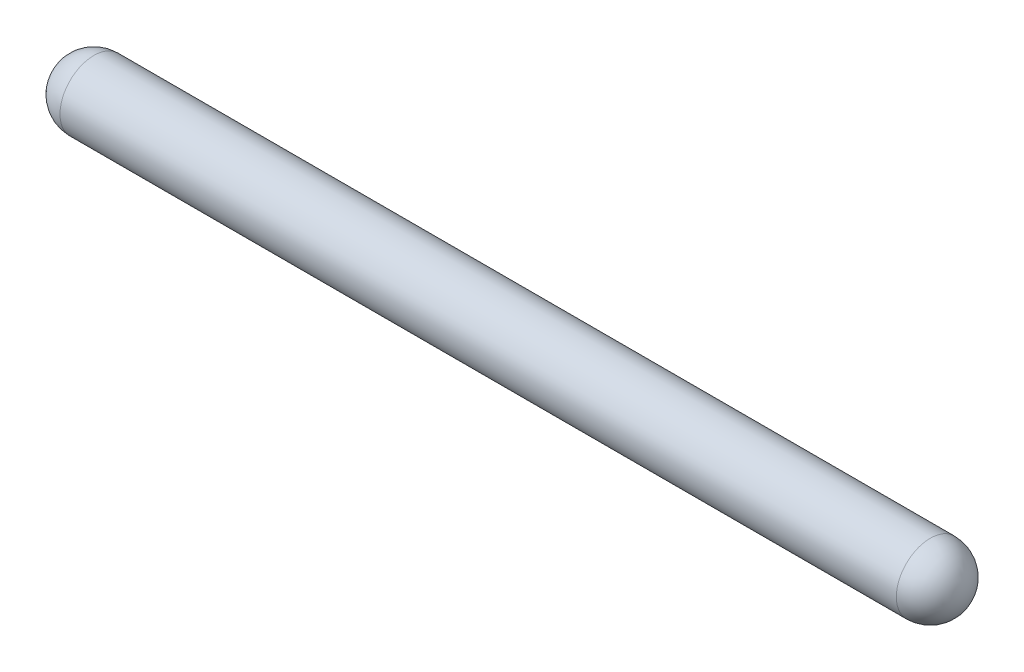
ISO-10303-21;
HEADER;
FILE_DESCRIPTION(('STEP AP214'),'2;1');
FILE_NAME('part.step','',(''),(''),'','','');
FILE_SCHEMA(('AUTOMOTIVE_DESIGN { 1 0 10303 214 1 1 1 1 }'));
ENDSEC;
DATA;
#1=APPLICATION_CONTEXT('core data for automotive mechanical design processes');
#2=APPLICATION_PROTOCOL_DEFINITION('international standard','automotive_design',2000,#1);
#3=PRODUCT_CONTEXT('',#1,'mechanical');
#4=PRODUCT('Part','Part','',(#3));
#5=PRODUCT_RELATED_PRODUCT_CATEGORY('part','',(#4));
#6=PRODUCT_DEFINITION_FORMATION('','',#4);
#7=PRODUCT_DEFINITION_CONTEXT('part definition',#1,'design');
#8=PRODUCT_DEFINITION('design','',#6,#7);
#9=PRODUCT_DEFINITION_SHAPE('','',#8);
#10=(LENGTH_UNIT() NAMED_UNIT(*) SI_UNIT(.MILLI.,.METRE.));
#11=(NAMED_UNIT(*) PLANE_ANGLE_UNIT() SI_UNIT($,.RADIAN.));
#12=(NAMED_UNIT(*) SI_UNIT($,.STERADIAN.) SOLID_ANGLE_UNIT());
#13=UNCERTAINTY_MEASURE_WITH_UNIT(LENGTH_MEASURE(1.E-05),#10,'distance_accuracy_value','');
#14=(GEOMETRIC_REPRESENTATION_CONTEXT(3) GLOBAL_UNCERTAINTY_ASSIGNED_CONTEXT((#13)) GLOBAL_UNIT_ASSIGNED_CONTEXT((#10,
#11,#12)) REPRESENTATION_CONTEXT('',''));
#15=CARTESIAN_POINT('',(0.,0.,0.));
#16=DIRECTION('',(0.,0.,1.));
#17=DIRECTION('',(1.,0.,0.));
#18=AXIS2_PLACEMENT_3D('',#15,#16,#17);
#19=CARTESIAN_POINT('',(63.5,0.,0.));
#20=DIRECTION('',(-1.,0.,0.));
#21=DIRECTION('',(0.,0.,1.));
#22=AXIS2_PLACEMENT_3D('',#19,#20,#21);
#23=CYLINDRICAL_SURFACE('',#22,2.38125);
#24=CARTESIAN_POINT('',(2.38125,0.,0.));
#25=DIRECTION('',(-1.,0.,0.));
#26=DIRECTION('',(0.,0.,1.));
#27=AXIS2_PLACEMENT_3D('',#24,#25,#26);
#28=CIRCLE('',#27,2.38125);
#29=CARTESIAN_POINT('',(2.38125,0.,2.38125));
#30=VERTEX_POINT('',#29);
#31=EDGE_CURVE('E10',#30,#30,#28,.F.);
#32=ORIENTED_EDGE('',*,*,#31,.T.);
#33=EDGE_LOOP('',(#32));
#34=FACE_BOUND('',#33,.T.);
#35=CARTESIAN_POINT('',(61.11875,0.,0.));
#36=DIRECTION('',(-1.,0.,0.));
#37=DIRECTION('',(0.,0.,1.));
#38=AXIS2_PLACEMENT_3D('',#35,#36,#37);
#39=CIRCLE('',#38,2.38125);
#40=CARTESIAN_POINT('',(61.11875,0.,2.38125));
#41=VERTEX_POINT('',#40);
#42=EDGE_CURVE('E38',#41,#41,#39,.T.);
#43=ORIENTED_EDGE('',*,*,#42,.T.);
#44=EDGE_LOOP('',(#43));
#45=FACE_BOUND('',#44,.T.);
#46=ADVANCED_FACE('F31',(#34,#45),#23,.T.);
#47=CARTESIAN_POINT('',(2.38125,0.,0.));
#48=DIRECTION('',(0.,0.,1.));
#49=DIRECTION('',(1.,0.,0.));
#50=AXIS2_PLACEMENT_3D('',#47,#48,#49);
#51=SPHERICAL_SURFACE('',#50,2.38125);
#52=CARTESIAN_POINT('',(2.38125,0.,0.));
#53=DIRECTION('',(-1.,0.,0.));
#54=DIRECTION('',(0.,0.,1.));
#55=AXIS2_PLACEMENT_3D('',#52,#53,#54);
#56=SPHERICAL_SURFACE('',#55,2.38125);
#57=ORIENTED_EDGE('',*,*,#31,.F.);
#58=EDGE_LOOP('',(#57));
#59=FACE_BOUND('',#58,.T.);
#60=ADVANCED_FACE('F46',(#59),#56,.T.);
#61=CARTESIAN_POINT('',(61.11875,0.,0.));
#62=DIRECTION('',(0.,0.,1.));
#63=DIRECTION('',(1.,0.,0.));
#64=AXIS2_PLACEMENT_3D('',#61,#62,#63);
#65=SPHERICAL_SURFACE('',#64,2.38125);
#66=CARTESIAN_POINT('',(61.11875,0.,0.));
#67=DIRECTION('',(-1.,0.,0.));
#68=DIRECTION('',(0.,0.,1.));
#69=AXIS2_PLACEMENT_3D('',#66,#67,#68);
#70=SPHERICAL_SURFACE('',#69,2.38125);
#71=ORIENTED_EDGE('',*,*,#42,.F.);
#72=EDGE_LOOP('',(#71));
#73=FACE_BOUND('',#72,.T.);
#74=ADVANCED_FACE('F33',(#73),#70,.T.);
#75=CLOSED_SHELL('',(#46,#60,#74));
#76=MANIFOLD_SOLID_BREP('B2',#75);
#77=ADVANCED_BREP_SHAPE_REPRESENTATION('',(#18,#76),#14);
#78=SHAPE_DEFINITION_REPRESENTATION(#9,#77);
ENDSEC;
END-ISO-10303-21;
